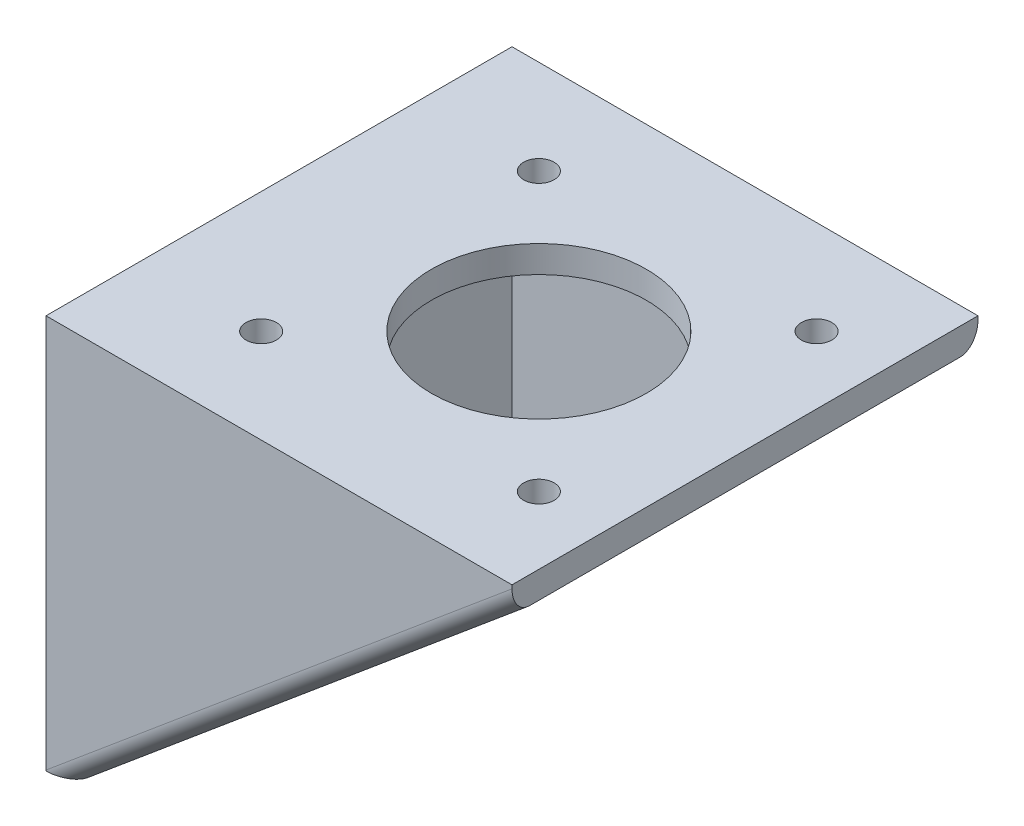
ISO-10303-21;
HEADER;
FILE_DESCRIPTION(('STEP AP214'),'2;1');
FILE_NAME('part.step','',(''),(''),'','','');
FILE_SCHEMA(('AUTOMOTIVE_DESIGN { 1 0 10303 214 1 1 1 1 }'));
ENDSEC;
DATA;
#1=APPLICATION_CONTEXT('core data for automotive mechanical design processes');
#2=APPLICATION_PROTOCOL_DEFINITION('international standard','automotive_design',2000,#1);
#3=PRODUCT_CONTEXT('',#1,'mechanical');
#4=PRODUCT('Part','Part','',(#3));
#5=PRODUCT_RELATED_PRODUCT_CATEGORY('part','',(#4));
#6=PRODUCT_DEFINITION_FORMATION('','',#4);
#7=PRODUCT_DEFINITION_CONTEXT('part definition',#1,'design');
#8=PRODUCT_DEFINITION('design','',#6,#7);
#9=PRODUCT_DEFINITION_SHAPE('','',#8);
#10=(LENGTH_UNIT() NAMED_UNIT(*) SI_UNIT(.MILLI.,.METRE.));
#11=(NAMED_UNIT(*) PLANE_ANGLE_UNIT() SI_UNIT($,.RADIAN.));
#12=(NAMED_UNIT(*) SI_UNIT($,.STERADIAN.) SOLID_ANGLE_UNIT());
#13=UNCERTAINTY_MEASURE_WITH_UNIT(LENGTH_MEASURE(1.E-05),#10,'distance_accuracy_value','');
#14=(GEOMETRIC_REPRESENTATION_CONTEXT(3) GLOBAL_UNCERTAINTY_ASSIGNED_CONTEXT((#13)) GLOBAL_UNIT_ASSIGNED_CONTEXT((#10,
#11,#12)) REPRESENTATION_CONTEXT('',''));
#15=CARTESIAN_POINT('',(0.,0.,0.));
#16=DIRECTION('',(0.,0.,1.));
#17=DIRECTION('',(1.,0.,0.));
#18=AXIS2_PLACEMENT_3D('',#15,#16,#17);
#19=CARTESIAN_POINT('',(0.,0.,0.));
#20=DIRECTION('',(0.,-1.,0.));
#21=DIRECTION('',(0.,0.,-1.));
#22=AXIS2_PLACEMENT_3D('',#19,#20,#21);
#23=PLANE('',#22);
#24=CARTESIAN_POINT('',(15.494,0.,15.494));
#25=DIRECTION('',(0.,-1.,0.));
#26=DIRECTION('',(0.,0.,-1.));
#27=AXIS2_PLACEMENT_3D('',#24,#25,#26);
#28=CIRCLE('',#27,1.69999999999999);
#29=CARTESIAN_POINT('',(15.494,0.,13.794));
#30=VERTEX_POINT('',#29);
#31=EDGE_CURVE('E314',#30,#30,#28,.T.);
#32=ORIENTED_EDGE('',*,*,#31,.F.);
#33=EDGE_LOOP('',(#32));
#34=FACE_BOUND('',#33,.T.);
#35=CARTESIAN_POINT('',(-15.494,0.,15.494));
#36=DIRECTION('',(0.,-1.,0.));
#37=DIRECTION('',(0.,0.,-1.));
#38=AXIS2_PLACEMENT_3D('',#35,#36,#37);
#39=CIRCLE('',#38,1.69999999999999);
#40=CARTESIAN_POINT('',(-15.494,0.,13.794));
#41=VERTEX_POINT('',#40);
#42=EDGE_CURVE('E322',#41,#41,#39,.T.);
#43=ORIENTED_EDGE('',*,*,#42,.F.);
#44=EDGE_LOOP('',(#43));
#45=FACE_BOUND('',#44,.T.);
#46=CARTESIAN_POINT('',(-15.494,0.,-15.494));
#47=DIRECTION('',(0.,-1.,0.));
#48=DIRECTION('',(0.,0.,-1.));
#49=AXIS2_PLACEMENT_3D('',#46,#47,#48);
#50=CIRCLE('',#49,1.69999999999999);
#51=CARTESIAN_POINT('',(-15.494,0.,-17.194));
#52=VERTEX_POINT('',#51);
#53=EDGE_CURVE('E330',#52,#52,#50,.T.);
#54=ORIENTED_EDGE('',*,*,#53,.F.);
#55=EDGE_LOOP('',(#54));
#56=FACE_BOUND('',#55,.T.);
#57=CARTESIAN_POINT('',(15.494,0.,-15.494));
#58=DIRECTION('',(0.,-1.,0.));
#59=DIRECTION('',(0.,0.,-1.));
#60=AXIS2_PLACEMENT_3D('',#57,#58,#59);
#61=CIRCLE('',#60,1.69999999999999);
#62=CARTESIAN_POINT('',(15.494,0.,-17.194));
#63=VERTEX_POINT('',#62);
#64=EDGE_CURVE('E159',#63,#63,#61,.T.);
#65=ORIENTED_EDGE('',*,*,#64,.F.);
#66=EDGE_LOOP('',(#65));
#67=FACE_BOUND('',#66,.T.);
#68=CARTESIAN_POINT('',(0.,0.,0.));
#69=DIRECTION('',(0.,1.,0.));
#70=DIRECTION('',(0.,0.,1.));
#71=AXIS2_PLACEMENT_3D('',#68,#69,#70);
#72=CIRCLE('',#71,12.);
#73=CARTESIAN_POINT('',(0.,0.,12.));
#74=VERTEX_POINT('',#73);
#75=EDGE_CURVE('E143',#74,#74,#72,.T.);
#76=ORIENTED_EDGE('',*,*,#75,.T.);
#77=EDGE_LOOP('',(#76));
#78=FACE_BOUND('',#77,.T.);
#79=DIRECTION('',(0.,0.,-1.));
#80=VECTOR('',#79,1.);
#81=CARTESIAN_POINT('',(23.,0.,-26.));
#82=LINE('',#81,#80);
#83=CARTESIAN_POINT('',(23.,0.,23.));
#84=VERTEX_POINT('',#83);
#85=CARTESIAN_POINT('',(23.,0.,-23.));
#86=VERTEX_POINT('',#85);
#87=EDGE_CURVE('E135',#84,#86,#82,.T.);
#88=ORIENTED_EDGE('',*,*,#87,.F.);
#89=DIRECTION('',(-1.,0.,0.));
#90=VECTOR('',#89,1.);
#91=CARTESIAN_POINT('',(-26.,0.,23.));
#92=LINE('',#91,#90);
#93=CARTESIAN_POINT('',(-26.,0.,23.));
#94=VERTEX_POINT('',#93);
#95=EDGE_CURVE('E121',#84,#94,#92,.T.);
#96=ORIENTED_EDGE('',*,*,#95,.T.);
#97=DIRECTION('',(0.,0.,-1.));
#98=VECTOR('',#97,1.);
#99=CARTESIAN_POINT('',(-26.,0.,-26.));
#100=LINE('',#99,#98);
#101=CARTESIAN_POINT('',(-26.,0.,-23.));
#102=VERTEX_POINT('',#101);
#103=EDGE_CURVE('E133',#94,#102,#100,.T.);
#104=ORIENTED_EDGE('',*,*,#103,.T.);
#105=DIRECTION('',(1.,0.,0.));
#106=VECTOR('',#105,1.);
#107=CARTESIAN_POINT('',(23.,0.,-23.));
#108=LINE('',#107,#106);
#109=EDGE_CURVE('E248',#102,#86,#108,.T.);
#110=ORIENTED_EDGE('',*,*,#109,.T.);
#111=EDGE_LOOP('',(#88,#96,#104,#110));
#112=FACE_BOUND('',#111,.T.);
#113=ADVANCED_FACE('F39',(#34,#45,#56,#67,#78,#112),#23,.T.);
#114=CARTESIAN_POINT('',(-26.,0.,0.));
#115=DIRECTION('',(-1.,0.,0.));
#116=DIRECTION('',(0.,0.,1.));
#117=AXIS2_PLACEMENT_3D('',#114,#115,#116);
#118=PLANE('',#117);
#119=CARTESIAN_POINT('',(-26.,-9.,10.));
#120=DIRECTION('',(1.,0.,0.));
#121=DIRECTION('',(0.,0.,-1.));
#122=AXIS2_PLACEMENT_3D('',#119,#120,#121);
#123=CIRCLE('',#122,2.24999999999999);
#124=CARTESIAN_POINT('',(-26.,-9.,7.75000000000002));
#125=VERTEX_POINT('',#124);
#126=EDGE_CURVE('E262',#125,#125,#123,.T.);
#127=ORIENTED_EDGE('',*,*,#126,.F.);
#128=EDGE_LOOP('',(#127));
#129=FACE_BOUND('',#128,.T.);
#130=CARTESIAN_POINT('',(-26.,-8.99999999999999,-9.99999999999999));
#131=DIRECTION('',(1.,0.,0.));
#132=DIRECTION('',(0.,0.,-1.));
#133=AXIS2_PLACEMENT_3D('',#130,#131,#132);
#134=CIRCLE('',#133,2.24999999999999);
#135=CARTESIAN_POINT('',(-26.,-8.99999999999999,-12.25));
#136=VERTEX_POINT('',#135);
#137=EDGE_CURVE('E270',#136,#136,#134,.T.);
#138=ORIENTED_EDGE('',*,*,#137,.F.);
#139=EDGE_LOOP('',(#138));
#140=FACE_BOUND('',#139,.T.);
#141=CARTESIAN_POINT('',(-26.,-31.,-9.99999999999999));
#142=DIRECTION('',(1.,0.,0.));
#143=DIRECTION('',(0.,0.,-1.));
#144=AXIS2_PLACEMENT_3D('',#141,#142,#143);
#145=CIRCLE('',#144,2.24999999999999);
#146=CARTESIAN_POINT('',(-26.,-31.,-12.25));
#147=VERTEX_POINT('',#146);
#148=EDGE_CURVE('E278',#147,#147,#145,.T.);
#149=ORIENTED_EDGE('',*,*,#148,.F.);
#150=EDGE_LOOP('',(#149));
#151=FACE_BOUND('',#150,.T.);
#152=CARTESIAN_POINT('',(-26.,-31.,10.));
#153=DIRECTION('',(1.,0.,0.));
#154=DIRECTION('',(0.,0.,-1.));
#155=AXIS2_PLACEMENT_3D('',#152,#153,#154);
#156=CIRCLE('',#155,2.24999999999999);
#157=CARTESIAN_POINT('',(-26.,-31.,7.75000000000001));
#158=VERTEX_POINT('',#157);
#159=EDGE_CURVE('E286',#158,#158,#156,.T.);
#160=ORIENTED_EDGE('',*,*,#159,.F.);
#161=EDGE_LOOP('',(#160));
#162=FACE_BOUND('',#161,.T.);
#163=CARTESIAN_POINT('',(-26.,-8.99999999999999,0.));
#164=DIRECTION('',(1.,0.,0.));
#165=DIRECTION('',(0.,0.,-1.));
#166=AXIS2_PLACEMENT_3D('',#163,#164,#165);
#167=CIRCLE('',#166,2.24999999999999);
#168=CARTESIAN_POINT('',(-26.,-8.99999999999999,-2.24999999999998));
#169=VERTEX_POINT('',#168);
#170=EDGE_CURVE('E294',#169,#169,#167,.T.);
#171=ORIENTED_EDGE('',*,*,#170,.F.);
#172=EDGE_LOOP('',(#171));
#173=FACE_BOUND('',#172,.T.);
#174=CARTESIAN_POINT('',(-26.,-31.,0.));
#175=DIRECTION('',(1.,0.,0.));
#176=DIRECTION('',(0.,0.,-1.));
#177=AXIS2_PLACEMENT_3D('',#174,#175,#176);
#178=CIRCLE('',#177,2.24999999999999);
#179=CARTESIAN_POINT('',(-26.,-31.,-2.24999999999998));
#180=VERTEX_POINT('',#179);
#181=EDGE_CURVE('E302',#180,#180,#178,.T.);
#182=ORIENTED_EDGE('',*,*,#181,.F.);
#183=EDGE_LOOP('',(#182));
#184=FACE_BOUND('',#183,.T.);
#185=DIRECTION('',(0.,-1.,0.));
#186=VECTOR('',#185,1.);
#187=CARTESIAN_POINT('',(-26.,-41.,23.));
#188=LINE('',#187,#186);
#189=CARTESIAN_POINT('',(-26.,-41.,23.));
#190=VERTEX_POINT('',#189);
#191=EDGE_CURVE('E118',#94,#190,#188,.T.);
#192=ORIENTED_EDGE('',*,*,#191,.T.);
#193=DIRECTION('',(0.,0.,1.));
#194=VECTOR('',#193,1.);
#195=CARTESIAN_POINT('',(-26.,-41.,-26.));
#196=LINE('',#195,#194);
#197=CARTESIAN_POINT('',(-26.,-41.,-23.));
#198=VERTEX_POINT('',#197);
#199=EDGE_CURVE('E151',#198,#190,#196,.T.);
#200=ORIENTED_EDGE('',*,*,#199,.F.);
#201=DIRECTION('',(0.,1.,0.));
#202=VECTOR('',#201,1.);
#203=CARTESIAN_POINT('',(-26.,0.,-23.));
#204=LINE('',#203,#202);
#205=EDGE_CURVE('E141',#198,#102,#204,.T.);
#206=ORIENTED_EDGE('',*,*,#205,.T.);
#207=ORIENTED_EDGE('',*,*,#103,.F.);
#208=EDGE_LOOP('',(#192,#200,#206,#207));
#209=FACE_BOUND('',#208,.T.);
#210=ADVANCED_FACE('F139',(#129,#140,#151,#162,#173,#184,#209),#118,.F.);
#211=CARTESIAN_POINT('',(0.,3.,0.));
#212=DIRECTION('',(0.,-1.,0.));
#213=DIRECTION('',(0.,0.,-1.));
#214=AXIS2_PLACEMENT_3D('',#211,#212,#213);
#215=PLANE('',#214);
#216=CARTESIAN_POINT('',(15.494,3.,15.494));
#217=DIRECTION('',(0.,1.,0.));
#218=DIRECTION('',(0.,0.,1.));
#219=AXIS2_PLACEMENT_3D('',#216,#217,#218);
#220=CIRCLE('',#219,1.7);
#221=CARTESIAN_POINT('',(15.494,3.,17.194));
#222=VERTEX_POINT('',#221);
#223=EDGE_CURVE('E310',#222,#222,#220,.T.);
#224=ORIENTED_EDGE('',*,*,#223,.F.);
#225=EDGE_LOOP('',(#224));
#226=FACE_BOUND('',#225,.T.);
#227=CARTESIAN_POINT('',(-15.494,3.,15.494));
#228=DIRECTION('',(0.,1.,0.));
#229=DIRECTION('',(0.,0.,1.));
#230=AXIS2_PLACEMENT_3D('',#227,#228,#229);
#231=CIRCLE('',#230,1.7);
#232=CARTESIAN_POINT('',(-15.494,3.,17.194));
#233=VERTEX_POINT('',#232);
#234=EDGE_CURVE('E318',#233,#233,#231,.T.);
#235=ORIENTED_EDGE('',*,*,#234,.F.);
#236=EDGE_LOOP('',(#235));
#237=FACE_BOUND('',#236,.T.);
#238=CARTESIAN_POINT('',(-15.494,3.,-15.494));
#239=DIRECTION('',(0.,1.,0.));
#240=DIRECTION('',(0.,0.,1.));
#241=AXIS2_PLACEMENT_3D('',#238,#239,#240);
#242=CIRCLE('',#241,1.7);
#243=CARTESIAN_POINT('',(-15.494,3.,-13.794));
#244=VERTEX_POINT('',#243);
#245=EDGE_CURVE('E326',#244,#244,#242,.T.);
#246=ORIENTED_EDGE('',*,*,#245,.F.);
#247=EDGE_LOOP('',(#246));
#248=FACE_BOUND('',#247,.T.);
#249=CARTESIAN_POINT('',(15.494,3.,-15.494));
#250=DIRECTION('',(0.,1.,0.));
#251=DIRECTION('',(0.,0.,1.));
#252=AXIS2_PLACEMENT_3D('',#249,#250,#251);
#253=CIRCLE('',#252,1.7);
#254=CARTESIAN_POINT('',(15.494,3.,-13.794));
#255=VERTEX_POINT('',#254);
#256=EDGE_CURVE('E334',#255,#255,#253,.T.);
#257=ORIENTED_EDGE('',*,*,#256,.F.);
#258=EDGE_LOOP('',(#257));
#259=FACE_BOUND('',#258,.T.);
#260=DIRECTION('',(0.,0.,1.));
#261=VECTOR('',#260,1.);
#262=CARTESIAN_POINT('',(-29.,3.,26.));
#263=LINE('',#262,#261);
#264=CARTESIAN_POINT('',(-29.,3.,-26.));
#265=VERTEX_POINT('',#264);
#266=CARTESIAN_POINT('',(-29.,3.,26.));
#267=VERTEX_POINT('',#266);
#268=EDGE_CURVE('E163',#265,#267,#263,.T.);
#269=ORIENTED_EDGE('',*,*,#268,.T.);
#270=DIRECTION('',(1.,0.,0.));
#271=VECTOR('',#270,1.);
#272=CARTESIAN_POINT('',(23.,3.,26.));
#273=LINE('',#272,#271);
#274=CARTESIAN_POINT('',(23.,3.,26.));
#275=VERTEX_POINT('',#274);
#276=EDGE_CURVE('E167',#267,#275,#273,.T.);
#277=ORIENTED_EDGE('',*,*,#276,.T.);
#278=DIRECTION('',(0.,0.,-1.));
#279=VECTOR('',#278,1.);
#280=CARTESIAN_POINT('',(23.,3.,-26.));
#281=LINE('',#280,#279);
#282=CARTESIAN_POINT('',(23.,3.,-26.));
#283=VERTEX_POINT('',#282);
#284=EDGE_CURVE('E171',#275,#283,#281,.T.);
#285=ORIENTED_EDGE('',*,*,#284,.T.);
#286=DIRECTION('',(-1.,0.,0.));
#287=VECTOR('',#286,1.);
#288=CARTESIAN_POINT('',(-29.,3.,-26.));
#289=LINE('',#288,#287);
#290=EDGE_CURVE('E174',#283,#265,#289,.T.);
#291=ORIENTED_EDGE('',*,*,#290,.T.);
#292=EDGE_LOOP('',(#269,#277,#285,#291));
#293=FACE_BOUND('',#292,.T.);
#294=CARTESIAN_POINT('',(0.,3.,0.));
#295=DIRECTION('',(0.,1.,0.));
#296=DIRECTION('',(0.,0.,1.));
#297=AXIS2_PLACEMENT_3D('',#294,#295,#296);
#298=CIRCLE('',#297,12.);
#299=CARTESIAN_POINT('',(0.,3.,12.));
#300=VERTEX_POINT('',#299);
#301=EDGE_CURVE('E149',#300,#300,#298,.T.);
#302=ORIENTED_EDGE('',*,*,#301,.F.);
#303=EDGE_LOOP('',(#302));
#304=FACE_BOUND('',#303,.T.);
#305=ADVANCED_FACE('F229',(#226,#237,#248,#259,#293,#304),#215,.F.);
#306=CARTESIAN_POINT('',(-29.,3.,26.));
#307=DIRECTION('',(1.,0.,0.));
#308=DIRECTION('',(0.,0.,-1.));
#309=AXIS2_PLACEMENT_3D('',#306,#307,#308);
#310=PLANE('',#309);
#311=CARTESIAN_POINT('',(-29.,-9.,10.));
#312=DIRECTION('',(1.,0.,0.));
#313=DIRECTION('',(0.,0.,-1.));
#314=AXIS2_PLACEMENT_3D('',#311,#312,#313);
#315=CIRCLE('',#314,2.25);
#316=CARTESIAN_POINT('',(-29.,-9.,7.75000000000001));
#317=VERTEX_POINT('',#316);
#318=EDGE_CURVE('E266',#317,#317,#315,.T.);
#319=ORIENTED_EDGE('',*,*,#318,.T.);
#320=EDGE_LOOP('',(#319));
#321=FACE_BOUND('',#320,.T.);
#322=CARTESIAN_POINT('',(-29.,-8.99999999999999,-9.99999999999999));
#323=DIRECTION('',(1.,0.,0.));
#324=DIRECTION('',(0.,0.,-1.));
#325=AXIS2_PLACEMENT_3D('',#322,#323,#324);
#326=CIRCLE('',#325,2.25);
#327=CARTESIAN_POINT('',(-29.,-8.99999999999999,-12.25));
#328=VERTEX_POINT('',#327);
#329=EDGE_CURVE('E274',#328,#328,#326,.T.);
#330=ORIENTED_EDGE('',*,*,#329,.T.);
#331=EDGE_LOOP('',(#330));
#332=FACE_BOUND('',#331,.T.);
#333=CARTESIAN_POINT('',(-29.,-31.,-9.99999999999999));
#334=DIRECTION('',(1.,0.,0.));
#335=DIRECTION('',(0.,0.,-1.));
#336=AXIS2_PLACEMENT_3D('',#333,#334,#335);
#337=CIRCLE('',#336,2.25);
#338=CARTESIAN_POINT('',(-29.,-31.,-12.25));
#339=VERTEX_POINT('',#338);
#340=EDGE_CURVE('E282',#339,#339,#337,.T.);
#341=ORIENTED_EDGE('',*,*,#340,.T.);
#342=EDGE_LOOP('',(#341));
#343=FACE_BOUND('',#342,.T.);
#344=CARTESIAN_POINT('',(-29.,-31.,10.));
#345=DIRECTION('',(1.,0.,0.));
#346=DIRECTION('',(0.,0.,-1.));
#347=AXIS2_PLACEMENT_3D('',#344,#345,#346);
#348=CIRCLE('',#347,2.25);
#349=CARTESIAN_POINT('',(-29.,-31.,7.75));
#350=VERTEX_POINT('',#349);
#351=EDGE_CURVE('E290',#350,#350,#348,.T.);
#352=ORIENTED_EDGE('',*,*,#351,.T.);
#353=EDGE_LOOP('',(#352));
#354=FACE_BOUND('',#353,.T.);
#355=CARTESIAN_POINT('',(-29.,-8.99999999999999,0.));
#356=DIRECTION('',(1.,0.,0.));
#357=DIRECTION('',(0.,0.,-1.));
#358=AXIS2_PLACEMENT_3D('',#355,#356,#357);
#359=CIRCLE('',#358,2.25);
#360=CARTESIAN_POINT('',(-29.,-8.99999999999999,-2.24999999999999));
#361=VERTEX_POINT('',#360);
#362=EDGE_CURVE('E298',#361,#361,#359,.T.);
#363=ORIENTED_EDGE('',*,*,#362,.T.);
#364=EDGE_LOOP('',(#363));
#365=FACE_BOUND('',#364,.T.);
#366=CARTESIAN_POINT('',(-29.,-31.,0.));
#367=DIRECTION('',(1.,0.,0.));
#368=DIRECTION('',(0.,0.,-1.));
#369=AXIS2_PLACEMENT_3D('',#366,#367,#368);
#370=CIRCLE('',#369,2.25);
#371=CARTESIAN_POINT('',(-29.,-31.,-2.24999999999999));
#372=VERTEX_POINT('',#371);
#373=EDGE_CURVE('E306',#372,#372,#370,.T.);
#374=ORIENTED_EDGE('',*,*,#373,.T.);
#375=EDGE_LOOP('',(#374));
#376=FACE_BOUND('',#375,.T.);
#377=DIRECTION('',(0.,0.,1.));
#378=VECTOR('',#377,1.);
#379=CARTESIAN_POINT('',(-29.,-41.,-26.));
#380=LINE('',#379,#378);
#381=CARTESIAN_POINT('',(-29.,-41.,-25.9985995488125));
#382=VERTEX_POINT('',#381);
#383=CARTESIAN_POINT('',(-29.,-41.,25.9985995488125));
#384=VERTEX_POINT('',#383);
#385=EDGE_CURVE('E155',#382,#384,#380,.T.);
#386=ORIENTED_EDGE('',*,*,#385,.T.);
#387=CARTESIAN_POINT('',(-29.,-40.9024272906182,24.));
#388=DIRECTION('',(1.,0.,0.));
#389=DIRECTION('',(0.,-1.,0.));
#390=AXIS2_PLACEMENT_3D('',#387,#388,#389);
#391=ELLIPSE('',#390,2.60777679101441,2.);
#392=CARTESIAN_POINT('',(-29.,-40.9024272906182,26.));
#393=VERTEX_POINT('',#392);
#394=EDGE_CURVE('E215',#384,#393,#391,.F.);
#395=ORIENTED_EDGE('',*,*,#394,.T.);
#396=DIRECTION('',(0.,-1.,0.));
#397=VECTOR('',#396,1.);
#398=CARTESIAN_POINT('',(-29.,3.,26.));
#399=LINE('',#398,#397);
#400=EDGE_CURVE('E191',#267,#393,#399,.T.);
#401=ORIENTED_EDGE('',*,*,#400,.F.);
#402=ORIENTED_EDGE('',*,*,#268,.F.);
#403=DIRECTION('',(0.,-1.,0.));
#404=VECTOR('',#403,1.);
#405=CARTESIAN_POINT('',(-29.,3.,-26.));
#406=LINE('',#405,#404);
#407=CARTESIAN_POINT('',(-29.,-40.9024272906182,-26.));
#408=VERTEX_POINT('',#407);
#409=EDGE_CURVE('E177',#265,#408,#406,.T.);
#410=ORIENTED_EDGE('',*,*,#409,.T.);
#411=CARTESIAN_POINT('',(-29.,-40.9024272906182,-24.));
#412=DIRECTION('',(1.,0.,0.));
#413=DIRECTION('',(0.,1.,0.));
#414=AXIS2_PLACEMENT_3D('',#411,#412,#413);
#415=ELLIPSE('',#414,2.60777679101441,2.);
#416=EDGE_CURVE('E55',#408,#382,#415,.F.);
#417=ORIENTED_EDGE('',*,*,#416,.T.);
#418=EDGE_LOOP('',(#386,#395,#401,#402,#410,#417));
#419=FACE_BOUND('',#418,.T.);
#420=ADVANCED_FACE('F226',(#321,#332,#343,#354,#365,#376,#419),#310,.F.);
#421=CARTESIAN_POINT('',(23.,3.,26.));
#422=DIRECTION('',(0.,0.,-1.));
#423=DIRECTION('',(-1.,0.,0.));
#424=AXIS2_PLACEMENT_3D('',#421,#422,#423);
#425=PLANE('',#424);
#426=ORIENTED_EDGE('',*,*,#400,.T.);
#427=DIRECTION('',(0.766936804902696,0.641722632673684,0.));
#428=VECTOR('',#427,1.);
#429=CARTESIAN_POINT('',(21.7165547346526,1.53387360980539,26.));
#430=LINE('',#429,#428);
#431=CARTESIAN_POINT('',(23.,2.60777679101442,26.));
#432=VERTEX_POINT('',#431);
#433=EDGE_CURVE('E195',#393,#432,#430,.T.);
#434=ORIENTED_EDGE('',*,*,#433,.T.);
#435=DIRECTION('',(0.,-1.,0.));
#436=VECTOR('',#435,1.);
#437=CARTESIAN_POINT('',(23.,3.,26.));
#438=LINE('',#437,#436);
#439=EDGE_CURVE('E187',#275,#432,#438,.T.);
#440=ORIENTED_EDGE('',*,*,#439,.F.);
#441=ORIENTED_EDGE('',*,*,#276,.F.);
#442=EDGE_LOOP('',(#426,#434,#440,#441));
#443=FACE_BOUND('',#442,.T.);
#444=ADVANCED_FACE('F367',(#443),#425,.F.);
#445=CARTESIAN_POINT('',(23.,3.,-26.));
#446=DIRECTION('',(-1.,0.,0.));
#447=DIRECTION('',(0.,0.,1.));
#448=AXIS2_PLACEMENT_3D('',#445,#446,#447);
#449=PLANE('',#448);
#450=ORIENTED_EDGE('',*,*,#439,.T.);
#451=CARTESIAN_POINT('',(23.,2.60777679101442,24.));
#452=DIRECTION('',(-1.,0.,0.));
#453=DIRECTION('',(0.,-1.,0.));
#454=AXIS2_PLACEMENT_3D('',#451,#452,#453);
#455=ELLIPSE('',#454,2.60777679101441,2.);
#456=CARTESIAN_POINT('',(23.,0.,24.));
#457=VERTEX_POINT('',#456);
#458=EDGE_CURVE('E202',#432,#457,#455,.F.);
#459=ORIENTED_EDGE('',*,*,#458,.T.);
#460=EDGE_CURVE('E168',#457,#84,#82,.T.);
#461=ORIENTED_EDGE('',*,*,#460,.T.);
#462=ORIENTED_EDGE('',*,*,#87,.T.);
#463=DIRECTION('',(0.,0.,-1.));
#464=VECTOR('',#463,1.);
#465=CARTESIAN_POINT('',(23.,0.,-23.));
#466=LINE('',#465,#464);
#467=CARTESIAN_POINT('',(23.,0.,-24.));
#468=VERTEX_POINT('',#467);
#469=EDGE_CURVE('E237',#86,#468,#466,.T.);
#470=ORIENTED_EDGE('',*,*,#469,.T.);
#471=CARTESIAN_POINT('',(23.,2.6077767910144,-24.));
#472=DIRECTION('',(-1.,0.,0.));
#473=DIRECTION('',(0.,1.,0.));
#474=AXIS2_PLACEMENT_3D('',#471,#472,#473);
#475=ELLIPSE('',#474,2.60777679101441,2.);
#476=CARTESIAN_POINT('',(23.,2.60777679101441,-26.));
#477=VERTEX_POINT('',#476);
#478=EDGE_CURVE('E199',#468,#477,#475,.F.);
#479=ORIENTED_EDGE('',*,*,#478,.T.);
#480=DIRECTION('',(0.,-1.,0.));
#481=VECTOR('',#480,1.);
#482=CARTESIAN_POINT('',(23.,3.,-26.));
#483=LINE('',#482,#481);
#484=EDGE_CURVE('E183',#283,#477,#483,.T.);
#485=ORIENTED_EDGE('',*,*,#484,.F.);
#486=ORIENTED_EDGE('',*,*,#284,.F.);
#487=EDGE_LOOP('',(#450,#459,#461,#462,#470,#479,#485,#486));
#488=FACE_BOUND('',#487,.T.);
#489=ADVANCED_FACE('F234',(#488),#449,.F.);
#490=CARTESIAN_POINT('',(-29.,3.,-26.));
#491=DIRECTION('',(0.,0.,1.));
#492=DIRECTION('',(1.,0.,0.));
#493=AXIS2_PLACEMENT_3D('',#490,#491,#492);
#494=PLANE('',#493);
#495=ORIENTED_EDGE('',*,*,#484,.T.);
#496=DIRECTION('',(-0.766936804902696,-0.641722632673684,0.));
#497=VECTOR('',#496,1.);
#498=CARTESIAN_POINT('',(-27.2834452653474,-39.4661263901946,-26.));
#499=LINE('',#498,#497);
#500=EDGE_CURVE('E48',#477,#408,#499,.T.);
#501=ORIENTED_EDGE('',*,*,#500,.T.);
#502=ORIENTED_EDGE('',*,*,#409,.F.);
#503=ORIENTED_EDGE('',*,*,#290,.F.);
#504=EDGE_LOOP('',(#495,#501,#502,#503));
#505=FACE_BOUND('',#504,.T.);
#506=ADVANCED_FACE('F220',(#505),#494,.F.);
#507=CARTESIAN_POINT('',(0.,3.,0.));
#508=DIRECTION('',(0.,-1.,0.));
#509=DIRECTION('',(0.,0.,-1.));
#510=AXIS2_PLACEMENT_3D('',#507,#508,#509);
#511=CYLINDRICAL_SURFACE('',#510,12.);
#512=ORIENTED_EDGE('',*,*,#301,.T.);
#513=EDGE_LOOP('',(#512));
#514=FACE_BOUND('',#513,.T.);
#515=ORIENTED_EDGE('',*,*,#75,.F.);
#516=EDGE_LOOP('',(#515));
#517=FACE_BOUND('',#516,.T.);
#518=ADVANCED_FACE('F350',(#514,#517),#511,.F.);
#519=CARTESIAN_POINT('',(-26.,-41.,-26.));
#520=DIRECTION('',(0.,-1.,0.));
#521=DIRECTION('',(0.,0.,-1.));
#522=AXIS2_PLACEMENT_3D('',#519,#520,#521);
#523=PLANE('',#522);
#524=DIRECTION('',(0.,0.,1.));
#525=VECTOR('',#524,1.);
#526=CARTESIAN_POINT('',(-26.,-41.,23.));
#527=LINE('',#526,#525);
#528=CARTESIAN_POINT('',(-26.,-41.,24.));
#529=VERTEX_POINT('',#528);
#530=EDGE_CURVE('E250',#190,#529,#527,.T.);
#531=ORIENTED_EDGE('',*,*,#530,.T.);
#532=CARTESIAN_POINT('',(-29.1166112868221,-41.,24.));
#533=DIRECTION('',(0.,-1.,0.));
#534=DIRECTION('',(-1.,0.,0.));
#535=AXIS2_PLACEMENT_3D('',#532,#533,#534);
#536=ELLIPSE('',#535,3.1166112868221,2.);
#537=EDGE_CURVE('E210',#529,#384,#536,.T.);
#538=ORIENTED_EDGE('',*,*,#537,.T.);
#539=ORIENTED_EDGE('',*,*,#385,.F.);
#540=CARTESIAN_POINT('',(-29.1166112868221,-41.,-24.));
#541=DIRECTION('',(0.,-1.,0.));
#542=DIRECTION('',(1.,0.,0.));
#543=AXIS2_PLACEMENT_3D('',#540,#541,#542);
#544=ELLIPSE('',#543,3.1166112868221,2.);
#545=CARTESIAN_POINT('',(-26.,-41.,-24.));
#546=VERTEX_POINT('',#545);
#547=EDGE_CURVE('E62',#382,#546,#544,.T.);
#548=ORIENTED_EDGE('',*,*,#547,.T.);
#549=EDGE_CURVE('E144',#546,#198,#196,.T.);
#550=ORIENTED_EDGE('',*,*,#549,.T.);
#551=ORIENTED_EDGE('',*,*,#199,.T.);
#552=EDGE_LOOP('',(#531,#538,#539,#548,#550,#551));
#553=FACE_BOUND('',#552,.T.);
#554=ADVANCED_FACE('F245',(#553),#523,.T.);
#555=CARTESIAN_POINT('',(15.494,3.,-15.494));
#556=DIRECTION('',(0.,1.,0.));
#557=DIRECTION('',(0.,0.,1.));
#558=AXIS2_PLACEMENT_3D('',#555,#556,#557);
#559=CYLINDRICAL_SURFACE('',#558,1.69999999999999);
#560=ORIENTED_EDGE('',*,*,#64,.T.);
#561=EDGE_LOOP('',(#560));
#562=FACE_BOUND('',#561,.T.);
#563=ORIENTED_EDGE('',*,*,#256,.T.);
#564=EDGE_LOOP('',(#563));
#565=FACE_BOUND('',#564,.T.);
#566=ADVANCED_FACE('F341',(#562,#565),#559,.F.);
#567=CARTESIAN_POINT('',(-15.494,3.,-15.494));
#568=DIRECTION('',(0.,1.,0.));
#569=DIRECTION('',(0.,0.,1.));
#570=AXIS2_PLACEMENT_3D('',#567,#568,#569);
#571=CYLINDRICAL_SURFACE('',#570,1.69999999999999);
#572=ORIENTED_EDGE('',*,*,#53,.T.);
#573=EDGE_LOOP('',(#572));
#574=FACE_BOUND('',#573,.T.);
#575=ORIENTED_EDGE('',*,*,#245,.T.);
#576=EDGE_LOOP('',(#575));
#577=FACE_BOUND('',#576,.T.);
#578=ADVANCED_FACE('F429',(#574,#577),#571,.F.);
#579=CARTESIAN_POINT('',(-15.494,3.,15.494));
#580=DIRECTION('',(0.,1.,0.));
#581=DIRECTION('',(0.,0.,1.));
#582=AXIS2_PLACEMENT_3D('',#579,#580,#581);
#583=CYLINDRICAL_SURFACE('',#582,1.69999999999999);
#584=ORIENTED_EDGE('',*,*,#42,.T.);
#585=EDGE_LOOP('',(#584));
#586=FACE_BOUND('',#585,.T.);
#587=ORIENTED_EDGE('',*,*,#234,.T.);
#588=EDGE_LOOP('',(#587));
#589=FACE_BOUND('',#588,.T.);
#590=ADVANCED_FACE('F425',(#586,#589),#583,.F.);
#591=CARTESIAN_POINT('',(15.494,3.,15.494));
#592=DIRECTION('',(0.,1.,0.));
#593=DIRECTION('',(0.,0.,1.));
#594=AXIS2_PLACEMENT_3D('',#591,#592,#593);
#595=CYLINDRICAL_SURFACE('',#594,1.69999999999999);
#596=ORIENTED_EDGE('',*,*,#31,.T.);
#597=EDGE_LOOP('',(#596));
#598=FACE_BOUND('',#597,.T.);
#599=ORIENTED_EDGE('',*,*,#223,.T.);
#600=EDGE_LOOP('',(#599));
#601=FACE_BOUND('',#600,.T.);
#602=ADVANCED_FACE('F421',(#598,#601),#595,.F.);
#603=CARTESIAN_POINT('',(-26.,-31.,0.));
#604=DIRECTION('',(1.,0.,0.));
#605=DIRECTION('',(0.,0.,-1.));
#606=AXIS2_PLACEMENT_3D('',#603,#604,#605);
#607=CYLINDRICAL_SURFACE('',#606,2.24999999999999);
#608=ORIENTED_EDGE('',*,*,#373,.F.);
#609=EDGE_LOOP('',(#608));
#610=FACE_BOUND('',#609,.T.);
#611=ORIENTED_EDGE('',*,*,#181,.T.);
#612=EDGE_LOOP('',(#611));
#613=FACE_BOUND('',#612,.T.);
#614=ADVANCED_FACE('F417',(#610,#613),#607,.F.);
#615=CARTESIAN_POINT('',(-26.,-8.99999999999999,0.));
#616=DIRECTION('',(1.,0.,0.));
#617=DIRECTION('',(0.,0.,-1.));
#618=AXIS2_PLACEMENT_3D('',#615,#616,#617);
#619=CYLINDRICAL_SURFACE('',#618,2.24999999999999);
#620=ORIENTED_EDGE('',*,*,#362,.F.);
#621=EDGE_LOOP('',(#620));
#622=FACE_BOUND('',#621,.T.);
#623=ORIENTED_EDGE('',*,*,#170,.T.);
#624=EDGE_LOOP('',(#623));
#625=FACE_BOUND('',#624,.T.);
#626=ADVANCED_FACE('F413',(#622,#625),#619,.F.);
#627=CARTESIAN_POINT('',(-26.,-31.,10.));
#628=DIRECTION('',(1.,0.,0.));
#629=DIRECTION('',(0.,0.,-1.));
#630=AXIS2_PLACEMENT_3D('',#627,#628,#629);
#631=CYLINDRICAL_SURFACE('',#630,2.24999999999999);
#632=ORIENTED_EDGE('',*,*,#351,.F.);
#633=EDGE_LOOP('',(#632));
#634=FACE_BOUND('',#633,.T.);
#635=ORIENTED_EDGE('',*,*,#159,.T.);
#636=EDGE_LOOP('',(#635));
#637=FACE_BOUND('',#636,.T.);
#638=ADVANCED_FACE('F409',(#634,#637),#631,.F.);
#639=CARTESIAN_POINT('',(-26.,-31.,-9.99999999999999));
#640=DIRECTION('',(1.,0.,0.));
#641=DIRECTION('',(0.,0.,-1.));
#642=AXIS2_PLACEMENT_3D('',#639,#640,#641);
#643=CYLINDRICAL_SURFACE('',#642,2.24999999999999);
#644=ORIENTED_EDGE('',*,*,#340,.F.);
#645=EDGE_LOOP('',(#644));
#646=FACE_BOUND('',#645,.T.);
#647=ORIENTED_EDGE('',*,*,#148,.T.);
#648=EDGE_LOOP('',(#647));
#649=FACE_BOUND('',#648,.T.);
#650=ADVANCED_FACE('F405',(#646,#649),#643,.F.);
#651=CARTESIAN_POINT('',(-26.,-8.99999999999999,-9.99999999999999));
#652=DIRECTION('',(1.,0.,0.));
#653=DIRECTION('',(0.,0.,-1.));
#654=AXIS2_PLACEMENT_3D('',#651,#652,#653);
#655=CYLINDRICAL_SURFACE('',#654,2.24999999999999);
#656=ORIENTED_EDGE('',*,*,#329,.F.);
#657=EDGE_LOOP('',(#656));
#658=FACE_BOUND('',#657,.T.);
#659=ORIENTED_EDGE('',*,*,#137,.T.);
#660=EDGE_LOOP('',(#659));
#661=FACE_BOUND('',#660,.T.);
#662=ADVANCED_FACE('F401',(#658,#661),#655,.F.);
#663=CARTESIAN_POINT('',(-26.,-9.,10.));
#664=DIRECTION('',(1.,0.,0.));
#665=DIRECTION('',(0.,0.,-1.));
#666=AXIS2_PLACEMENT_3D('',#663,#664,#665);
#667=CYLINDRICAL_SURFACE('',#666,2.24999999999999);
#668=ORIENTED_EDGE('',*,*,#318,.F.);
#669=EDGE_LOOP('',(#668));
#670=FACE_BOUND('',#669,.T.);
#671=ORIENTED_EDGE('',*,*,#126,.T.);
#672=EDGE_LOOP('',(#671));
#673=FACE_BOUND('',#672,.T.);
#674=ADVANCED_FACE('F398',(#670,#673),#667,.F.);
#675=CARTESIAN_POINT('',(-26.,-41.,-23.));
#676=DIRECTION('',(0.641722632673684,-0.766936804902696,0.));
#677=DIRECTION('',(0.766936804902696,0.641722632673684,0.));
#678=AXIS2_PLACEMENT_3D('',#675,#676,#677);
#679=PLANE('',#678);
#680=ORIENTED_EDGE('',*,*,#549,.F.);
#681=DIRECTION('',(-0.766936804902696,-0.641722632673684,0.));
#682=VECTOR('',#681,1.);
#683=CARTESIAN_POINT('',(23.,0.,-24.));
#684=LINE('',#683,#682);
#685=EDGE_CURVE('E11',#546,#468,#684,.F.);
#686=ORIENTED_EDGE('',*,*,#685,.T.);
#687=ORIENTED_EDGE('',*,*,#469,.F.);
#688=DIRECTION('',(-0.766936804902696,-0.641722632673684,0.));
#689=VECTOR('',#688,1.);
#690=CARTESIAN_POINT('',(-26.,-41.,-23.));
#691=LINE('',#690,#689);
#692=EDGE_CURVE('E243',#86,#198,#691,.T.);
#693=ORIENTED_EDGE('',*,*,#692,.T.);
#694=EDGE_LOOP('',(#680,#686,#687,#693));
#695=FACE_BOUND('',#694,.T.);
#696=ADVANCED_FACE('F240',(#695),#679,.T.);
#697=CARTESIAN_POINT('',(0.,0.,-23.));
#698=DIRECTION('',(0.,0.,-1.));
#699=DIRECTION('',(-1.,0.,0.));
#700=AXIS2_PLACEMENT_3D('',#697,#698,#699);
#701=PLANE('',#700);
#702=ORIENTED_EDGE('',*,*,#205,.F.);
#703=ORIENTED_EDGE('',*,*,#692,.F.);
#704=ORIENTED_EDGE('',*,*,#109,.F.);
#705=EDGE_LOOP('',(#702,#703,#704));
#706=FACE_BOUND('',#705,.T.);
#707=ADVANCED_FACE('F247',(#706),#701,.F.);
#708=CARTESIAN_POINT('',(23.,0.,23.));
#709=DIRECTION('',(0.641722632673684,-0.766936804902696,0.));
#710=DIRECTION('',(0.766936804902696,0.641722632673684,0.));
#711=AXIS2_PLACEMENT_3D('',#708,#709,#710);
#712=PLANE('',#711);
#713=ORIENTED_EDGE('',*,*,#460,.F.);
#714=DIRECTION('',(0.766936804902696,0.641722632673684,0.));
#715=VECTOR('',#714,1.);
#716=CARTESIAN_POINT('',(-26.,-41.,24.));
#717=LINE('',#716,#715);
#718=EDGE_CURVE('E205',#457,#529,#717,.F.);
#719=ORIENTED_EDGE('',*,*,#718,.T.);
#720=ORIENTED_EDGE('',*,*,#530,.F.);
#721=DIRECTION('',(0.766936804902696,0.641722632673684,0.));
#722=VECTOR('',#721,1.);
#723=CARTESIAN_POINT('',(23.,0.,23.));
#724=LINE('',#723,#722);
#725=EDGE_CURVE('E123',#190,#84,#724,.T.);
#726=ORIENTED_EDGE('',*,*,#725,.T.);
#727=EDGE_LOOP('',(#713,#719,#720,#726));
#728=FACE_BOUND('',#727,.T.);
#729=ADVANCED_FACE('F380',(#728),#712,.T.);
#730=CARTESIAN_POINT('',(0.,0.,23.));
#731=DIRECTION('',(0.,0.,1.));
#732=DIRECTION('',(1.,0.,0.));
#733=AXIS2_PLACEMENT_3D('',#730,#731,#732);
#734=PLANE('',#733);
#735=ORIENTED_EDGE('',*,*,#95,.F.);
#736=ORIENTED_EDGE('',*,*,#725,.F.);
#737=ORIENTED_EDGE('',*,*,#191,.F.);
#738=EDGE_LOOP('',(#735,#736,#737));
#739=FACE_BOUND('',#738,.T.);
#740=ADVANCED_FACE('F120',(#739),#734,.F.);
#741=CARTESIAN_POINT('',(23.1930368512621,2.76929742166233,24.));
#742=DIRECTION('',(-0.766936804902696,-0.641722632673684,0.));
#743=DIRECTION('',(0.641722632673684,-0.766936804902696,0.));
#744=AXIS2_PLACEMENT_3D('',#741,#742,#743);
#745=CYLINDRICAL_SURFACE('',#744,2.);
#746=ORIENTED_EDGE('',*,*,#537,.F.);
#747=ORIENTED_EDGE('',*,*,#718,.F.);
#748=ORIENTED_EDGE('',*,*,#458,.F.);
#749=ORIENTED_EDGE('',*,*,#433,.F.);
#750=ORIENTED_EDGE('',*,*,#394,.F.);
#751=EDGE_LOOP('',(#746,#747,#748,#749,#750));
#752=FACE_BOUND('',#751,.T.);
#753=ADVANCED_FACE('F373',(#752),#745,.T.);
#754=CARTESIAN_POINT('',(-7.39295040988436,-22.8230592662358,-24.));
#755=DIRECTION('',(0.766936804902696,0.641722632673684,0.));
#756=DIRECTION('',(-0.641722632673684,0.766936804902696,0.));
#757=AXIS2_PLACEMENT_3D('',#754,#755,#756);
#758=CYLINDRICAL_SURFACE('',#757,2.);
#759=ORIENTED_EDGE('',*,*,#478,.F.);
#760=ORIENTED_EDGE('',*,*,#685,.F.);
#761=ORIENTED_EDGE('',*,*,#547,.F.);
#762=ORIENTED_EDGE('',*,*,#416,.F.);
#763=ORIENTED_EDGE('',*,*,#500,.F.);
#764=EDGE_LOOP('',(#759,#760,#761,#762,#763));
#765=FACE_BOUND('',#764,.T.);
#766=ADVANCED_FACE('F41',(#765),#758,.T.);
#767=CLOSED_SHELL('',(#113,#210,#305,#420,#444,#489,#506,#518,#554,#566,#578,#590,#602,#614,
#626,#638,#650,#662,#674,#696,#707,#729,#740,#753,#766));
#768=MANIFOLD_SOLID_BREP('B2',#767);
#769=ADVANCED_BREP_SHAPE_REPRESENTATION('',(#18,#768),#14);
#770=SHAPE_DEFINITION_REPRESENTATION(#9,#769);
ENDSEC;
END-ISO-10303-21;
